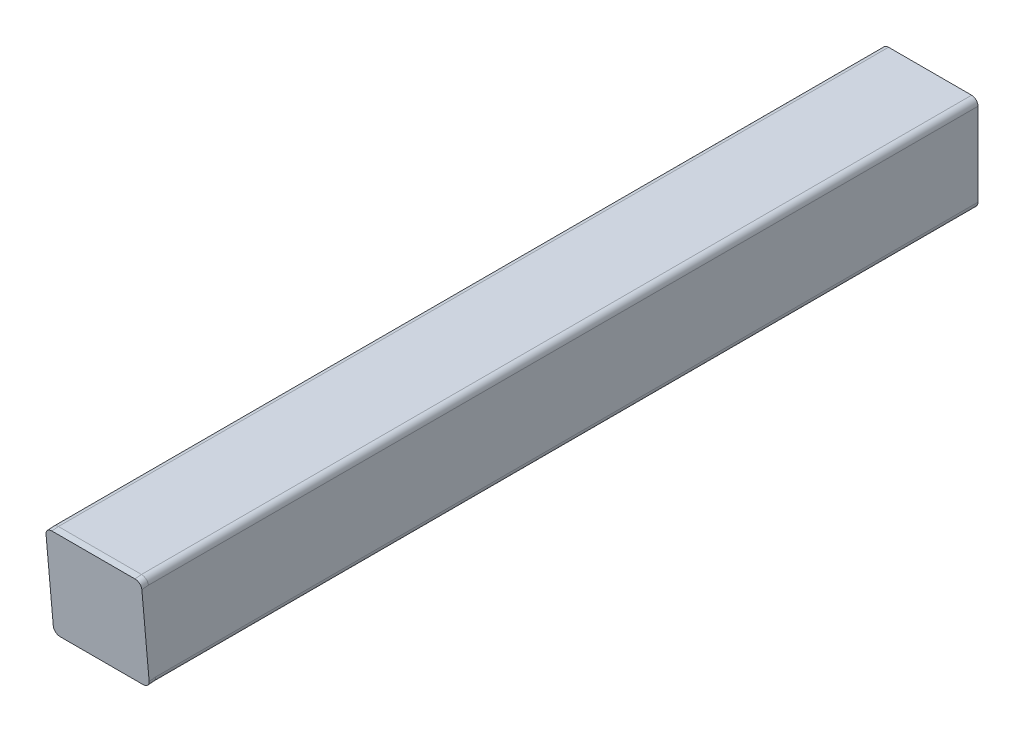
ISO-10303-21;
HEADER;
FILE_DESCRIPTION(('STEP AP214'),'2;1');
FILE_NAME('part.step','',(''),(''),'','','');
FILE_SCHEMA(('AUTOMOTIVE_DESIGN { 1 0 10303 214 1 1 1 1 }'));
ENDSEC;
DATA;
#1=APPLICATION_CONTEXT('core data for automotive mechanical design processes');
#2=APPLICATION_PROTOCOL_DEFINITION('international standard','automotive_design',2000,#1);
#3=PRODUCT_CONTEXT('',#1,'mechanical');
#4=PRODUCT('Part','Part','',(#3));
#5=PRODUCT_RELATED_PRODUCT_CATEGORY('part','',(#4));
#6=PRODUCT_DEFINITION_FORMATION('','',#4);
#7=PRODUCT_DEFINITION_CONTEXT('part definition',#1,'design');
#8=PRODUCT_DEFINITION('design','',#6,#7);
#9=PRODUCT_DEFINITION_SHAPE('','',#8);
#10=(LENGTH_UNIT() NAMED_UNIT(*) SI_UNIT(.MILLI.,.METRE.));
#11=(NAMED_UNIT(*) PLANE_ANGLE_UNIT() SI_UNIT($,.RADIAN.));
#12=(NAMED_UNIT(*) SI_UNIT($,.STERADIAN.) SOLID_ANGLE_UNIT());
#13=UNCERTAINTY_MEASURE_WITH_UNIT(LENGTH_MEASURE(1.E-05),#10,'distance_accuracy_value','');
#14=(GEOMETRIC_REPRESENTATION_CONTEXT(3) GLOBAL_UNCERTAINTY_ASSIGNED_CONTEXT((#13)) GLOBAL_UNIT_ASSIGNED_CONTEXT((#10,
#11,#12)) REPRESENTATION_CONTEXT('',''));
#15=CARTESIAN_POINT('',(0.,0.,0.));
#16=DIRECTION('',(0.,0.,1.));
#17=DIRECTION('',(1.,0.,0.));
#18=AXIS2_PLACEMENT_3D('',#15,#16,#17);
#19=CARTESIAN_POINT('',(2.54,-35.56,0.));
#20=DIRECTION('',(0.,0.,1.));
#21=DIRECTION('',(1.,0.,0.));
#22=AXIS2_PLACEMENT_3D('',#19,#20,#21);
#23=PLANE('',#22);
#24=CARTESIAN_POINT('',(2.54,-35.56,0.));
#25=DIRECTION('',(0.,0.,1.));
#26=DIRECTION('',(1.,0.,0.));
#27=AXIS2_PLACEMENT_3D('',#24,#25,#26);
#28=CIRCLE('',#27,2.54);
#29=CARTESIAN_POINT('',(0.,-35.56,0.));
#30=VERTEX_POINT('',#29);
#31=CARTESIAN_POINT('',(2.54000000000002,-38.1,0.));
#32=VERTEX_POINT('',#31);
#33=EDGE_CURVE('E358',#30,#32,#28,.T.);
#34=ORIENTED_EDGE('',*,*,#33,.F.);
#35=DIRECTION('',(0.,-1.,0.));
#36=VECTOR('',#35,1.);
#37=CARTESIAN_POINT('',(0.,-2.54000000000002,0.));
#38=LINE('',#37,#36);
#39=CARTESIAN_POINT('',(0.,-2.54000000000002,0.));
#40=VERTEX_POINT('',#39);
#41=EDGE_CURVE('E342',#40,#30,#38,.T.);
#42=ORIENTED_EDGE('',*,*,#41,.F.);
#43=CARTESIAN_POINT('',(2.54,-2.54,0.));
#44=DIRECTION('',(0.,0.,1.));
#45=DIRECTION('',(-1.,0.,0.));
#46=AXIS2_PLACEMENT_3D('',#43,#44,#45);
#47=CIRCLE('',#46,2.54);
#48=CARTESIAN_POINT('',(2.54000000000002,0.,0.));
#49=VERTEX_POINT('',#48);
#50=EDGE_CURVE('E345',#49,#40,#47,.T.);
#51=ORIENTED_EDGE('',*,*,#50,.F.);
#52=DIRECTION('',(-1.,0.,0.));
#53=VECTOR('',#52,1.);
#54=CARTESIAN_POINT('',(2.54000000000002,0.,0.));
#55=LINE('',#54,#53);
#56=CARTESIAN_POINT('',(35.56,0.,0.));
#57=VERTEX_POINT('',#56);
#58=EDGE_CURVE('E348',#57,#49,#55,.T.);
#59=ORIENTED_EDGE('',*,*,#58,.F.);
#60=CARTESIAN_POINT('',(35.56,-2.54,0.));
#61=DIRECTION('',(0.,0.,1.));
#62=DIRECTION('',(1.,0.,0.));
#63=AXIS2_PLACEMENT_3D('',#60,#61,#62);
#64=CIRCLE('',#63,2.54);
#65=CARTESIAN_POINT('',(38.1,-2.54000000000002,0.));
#66=VERTEX_POINT('',#65);
#67=EDGE_CURVE('E350',#66,#57,#64,.T.);
#68=ORIENTED_EDGE('',*,*,#67,.F.);
#69=DIRECTION('',(0.,1.,0.));
#70=VECTOR('',#69,1.);
#71=CARTESIAN_POINT('',(38.1,-2.54000000000002,0.));
#72=LINE('',#71,#70);
#73=CARTESIAN_POINT('',(38.1,-35.56,0.));
#74=VERTEX_POINT('',#73);
#75=EDGE_CURVE('E352',#74,#66,#72,.T.);
#76=ORIENTED_EDGE('',*,*,#75,.F.);
#77=CARTESIAN_POINT('',(35.56,-35.56,0.));
#78=DIRECTION('',(0.,0.,1.));
#79=DIRECTION('',(-1.,0.,0.));
#80=AXIS2_PLACEMENT_3D('',#77,#78,#79);
#81=CIRCLE('',#80,2.54);
#82=CARTESIAN_POINT('',(35.56,-38.1,0.));
#83=VERTEX_POINT('',#82);
#84=EDGE_CURVE('E355',#83,#74,#81,.T.);
#85=ORIENTED_EDGE('',*,*,#84,.F.);
#86=DIRECTION('',(1.,0.,0.));
#87=VECTOR('',#86,1.);
#88=CARTESIAN_POINT('',(2.54000000000002,-38.1,0.));
#89=LINE('',#88,#87);
#90=EDGE_CURVE('E321',#32,#83,#89,.T.);
#91=ORIENTED_EDGE('',*,*,#90,.F.);
#92=EDGE_LOOP('',(#34,#42,#51,#59,#68,#76,#85,#91));
#93=FACE_BOUND('',#92,.T.);
#94=CARTESIAN_POINT('',(5.3086,-32.7914,0.));
#95=DIRECTION('',(0.,0.,1.));
#96=DIRECTION('',(1.,0.,0.));
#97=AXIS2_PLACEMENT_3D('',#94,#95,#96);
#98=CIRCLE('',#97,2.54);
#99=CARTESIAN_POINT('',(2.7686,-32.7914,0.));
#100=VERTEX_POINT('',#99);
#101=CARTESIAN_POINT('',(5.30860000000002,-35.3314,0.));
#102=VERTEX_POINT('',#101);
#103=EDGE_CURVE('E400',#100,#102,#98,.T.);
#104=ORIENTED_EDGE('',*,*,#103,.T.);
#105=DIRECTION('',(1.,0.,0.));
#106=VECTOR('',#105,1.);
#107=CARTESIAN_POINT('',(5.30860000000002,-35.3314,0.));
#108=LINE('',#107,#106);
#109=CARTESIAN_POINT('',(32.7914,-35.3314,0.));
#110=VERTEX_POINT('',#109);
#111=EDGE_CURVE('E397',#102,#110,#108,.T.);
#112=ORIENTED_EDGE('',*,*,#111,.T.);
#113=CARTESIAN_POINT('',(32.7914,-32.7914,0.));
#114=DIRECTION('',(0.,0.,1.));
#115=DIRECTION('',(1.,0.,0.));
#116=AXIS2_PLACEMENT_3D('',#113,#114,#115);
#117=CIRCLE('',#116,2.54);
#118=CARTESIAN_POINT('',(35.3314,-32.7914,0.));
#119=VERTEX_POINT('',#118);
#120=EDGE_CURVE('E394',#110,#119,#117,.T.);
#121=ORIENTED_EDGE('',*,*,#120,.T.);
#122=DIRECTION('',(0.,1.,0.));
#123=VECTOR('',#122,1.);
#124=CARTESIAN_POINT('',(35.3314,-5.30860000000002,0.));
#125=LINE('',#124,#123);
#126=CARTESIAN_POINT('',(35.3314,-5.30860000000002,0.));
#127=VERTEX_POINT('',#126);
#128=EDGE_CURVE('E391',#119,#127,#125,.T.);
#129=ORIENTED_EDGE('',*,*,#128,.T.);
#130=CARTESIAN_POINT('',(32.7914,-5.3086,0.));
#131=DIRECTION('',(0.,0.,1.));
#132=DIRECTION('',(1.,0.,0.));
#133=AXIS2_PLACEMENT_3D('',#130,#131,#132);
#134=CIRCLE('',#133,2.54);
#135=CARTESIAN_POINT('',(32.7914,-2.7686,0.));
#136=VERTEX_POINT('',#135);
#137=EDGE_CURVE('E388',#127,#136,#134,.T.);
#138=ORIENTED_EDGE('',*,*,#137,.T.);
#139=DIRECTION('',(-1.,0.,0.));
#140=VECTOR('',#139,1.);
#141=CARTESIAN_POINT('',(5.30860000000002,-2.7686,0.));
#142=LINE('',#141,#140);
#143=CARTESIAN_POINT('',(5.30860000000002,-2.7686,0.));
#144=VERTEX_POINT('',#143);
#145=EDGE_CURVE('E385',#136,#144,#142,.T.);
#146=ORIENTED_EDGE('',*,*,#145,.T.);
#147=CARTESIAN_POINT('',(5.3086,-5.3086,0.));
#148=DIRECTION('',(0.,0.,1.));
#149=DIRECTION('',(1.,0.,0.));
#150=AXIS2_PLACEMENT_3D('',#147,#148,#149);
#151=CIRCLE('',#150,2.54);
#152=CARTESIAN_POINT('',(2.7686,-5.30860000000002,0.));
#153=VERTEX_POINT('',#152);
#154=EDGE_CURVE('E382',#144,#153,#151,.T.);
#155=ORIENTED_EDGE('',*,*,#154,.T.);
#156=DIRECTION('',(0.,-1.,0.));
#157=VECTOR('',#156,1.);
#158=CARTESIAN_POINT('',(2.7686,-5.30860000000002,0.));
#159=LINE('',#158,#157);
#160=EDGE_CURVE('E379',#153,#100,#159,.T.);
#161=ORIENTED_EDGE('',*,*,#160,.T.);
#162=EDGE_LOOP('',(#104,#112,#121,#129,#138,#146,#155,#161));
#163=FACE_BOUND('',#162,.T.);
#164=ADVANCED_FACE('F33',(#93,#163),#23,.F.);
#165=CARTESIAN_POINT('',(2.54,-35.56,330.));
#166=DIRECTION('',(0.,0.,-1.));
#167=DIRECTION('',(-1.,0.,0.));
#168=AXIS2_PLACEMENT_3D('',#165,#166,#167);
#169=CYLINDRICAL_SURFACE('',#168,2.54);
#170=DIRECTION('',(0.,0.,-1.));
#171=VECTOR('',#170,1.);
#172=CARTESIAN_POINT('',(2.54000000000002,-38.1,330.));
#173=LINE('',#172,#171);
#174=CARTESIAN_POINT('',(2.54000000000002,-38.1,326.666681919662));
#175=VERTEX_POINT('',#174);
#176=EDGE_CURVE('E41',#175,#32,#173,.T.);
#177=ORIENTED_EDGE('',*,*,#176,.F.);
#178=CARTESIAN_POINT('',(2.54,-35.56,326.888903125018));
#179=DIRECTION('',(0.,0.0871557427476583,-0.996194698091746));
#180=DIRECTION('',(0.,-0.996194698091746,-0.0871557427476583));
#181=AXIS2_PLACEMENT_3D('',#178,#179,#180);
#182=ELLIPSE('',#181,2.5497023873601,2.54);
#183=CARTESIAN_POINT('',(0.,-35.56,326.888903125018));
#184=VERTEX_POINT('',#183);
#185=EDGE_CURVE('E403',#175,#184,#182,.T.);
#186=ORIENTED_EDGE('',*,*,#185,.T.);
#187=DIRECTION('',(0.,0.,-1.));
#188=VECTOR('',#187,1.);
#189=CARTESIAN_POINT('',(0.,-35.56,330.));
#190=LINE('',#189,#188);
#191=EDGE_CURVE('E339',#184,#30,#190,.T.);
#192=ORIENTED_EDGE('',*,*,#191,.T.);
#193=ORIENTED_EDGE('',*,*,#33,.T.);
#194=EDGE_LOOP('',(#177,#186,#192,#193));
#195=FACE_BOUND('',#194,.T.);
#196=ADVANCED_FACE('F35',(#195),#169,.T.);
#197=CARTESIAN_POINT('',(2.54000000000002,-38.1,330.));
#198=DIRECTION('',(0.,1.,0.));
#199=DIRECTION('',(0.,0.,1.));
#200=AXIS2_PLACEMENT_3D('',#197,#198,#199);
#201=PLANE('',#200);
#202=DIRECTION('',(0.,0.,-1.));
#203=VECTOR('',#202,1.);
#204=CARTESIAN_POINT('',(35.56,-38.1,330.));
#205=LINE('',#204,#203);
#206=CARTESIAN_POINT('',(35.56,-38.1,326.666681919662));
#207=VERTEX_POINT('',#206);
#208=EDGE_CURVE('E318',#207,#83,#205,.T.);
#209=ORIENTED_EDGE('',*,*,#208,.F.);
#210=DIRECTION('',(1.,0.,0.));
#211=VECTOR('',#210,1.);
#212=CARTESIAN_POINT('',(0.,-38.1,326.666681919662));
#213=LINE('',#212,#211);
#214=EDGE_CURVE('E189',#175,#207,#213,.T.);
#215=ORIENTED_EDGE('',*,*,#214,.F.);
#216=ORIENTED_EDGE('',*,*,#176,.T.);
#217=ORIENTED_EDGE('',*,*,#90,.T.);
#218=EDGE_LOOP('',(#209,#215,#216,#217));
#219=FACE_BOUND('',#218,.T.);
#220=ADVANCED_FACE('F307',(#219),#201,.F.);
#221=CARTESIAN_POINT('',(35.56,-35.56,330.));
#222=DIRECTION('',(0.,0.,-1.));
#223=DIRECTION('',(-1.,0.,0.));
#224=AXIS2_PLACEMENT_3D('',#221,#222,#223);
#225=CYLINDRICAL_SURFACE('',#224,2.54);
#226=DIRECTION('',(0.,0.,-1.));
#227=VECTOR('',#226,1.);
#228=CARTESIAN_POINT('',(38.1,-35.56,330.));
#229=LINE('',#228,#227);
#230=CARTESIAN_POINT('',(38.1,-35.56,326.888903125018));
#231=VERTEX_POINT('',#230);
#232=EDGE_CURVE('E325',#231,#74,#229,.T.);
#233=ORIENTED_EDGE('',*,*,#232,.F.);
#234=CARTESIAN_POINT('',(35.56,-35.56,326.888903125018));
#235=DIRECTION('',(0.,0.0871557427476583,-0.996194698091746));
#236=DIRECTION('',(0.,-0.996194698091746,-0.0871557427476583));
#237=AXIS2_PLACEMENT_3D('',#234,#235,#236);
#238=ELLIPSE('',#237,2.5497023873601,2.54);
#239=EDGE_CURVE('E406',#231,#207,#238,.T.);
#240=ORIENTED_EDGE('',*,*,#239,.T.);
#241=ORIENTED_EDGE('',*,*,#208,.T.);
#242=ORIENTED_EDGE('',*,*,#84,.T.);
#243=EDGE_LOOP('',(#233,#240,#241,#242));
#244=FACE_BOUND('',#243,.T.);
#245=ADVANCED_FACE('F304',(#244),#225,.T.);
#246=CARTESIAN_POINT('',(38.1,-2.54000000000002,330.));
#247=DIRECTION('',(-1.,0.,0.));
#248=DIRECTION('',(0.,-1.,0.));
#249=AXIS2_PLACEMENT_3D('',#246,#247,#248);
#250=PLANE('',#249);
#251=DIRECTION('',(0.,0.,-1.));
#252=VECTOR('',#251,1.);
#253=CARTESIAN_POINT('',(38.1,-2.54000000000002,330.));
#254=LINE('',#253,#252);
#255=CARTESIAN_POINT('',(38.1,-2.54000000000001,329.777778794644));
#256=VERTEX_POINT('',#255);
#257=EDGE_CURVE('E327',#256,#66,#254,.T.);
#258=ORIENTED_EDGE('',*,*,#257,.F.);
#259=DIRECTION('',(0.,0.0871557427476583,-0.996194698091745));
#260=VECTOR('',#259,1.);
#261=CARTESIAN_POINT('',(38.1,-7.4730056636738,386.162291540254));
#262=LINE('',#261,#260);
#263=CARTESIAN_POINT('',(38.1,-2.76794261949674,332.38317485752));
#264=VERTEX_POINT('',#263);
#265=EDGE_CURVE('E214',#264,#256,#262,.T.);
#266=ORIENTED_EDGE('',*,*,#265,.F.);
#267=DIRECTION('',(0.,0.996194698091746,0.0871557427476584));
#268=VECTOR('',#267,1.);
#269=CARTESIAN_POINT('',(38.1,-35.7879426194967,329.494299187894));
#270=LINE('',#269,#268);
#271=CARTESIAN_POINT('',(38.1,-35.7879426194967,329.494299187894));
#272=VERTEX_POINT('',#271);
#273=EDGE_CURVE('E198',#272,#264,#270,.T.);
#274=ORIENTED_EDGE('',*,*,#273,.F.);
#275=DIRECTION('',(0.,0.0871557427476583,-0.996194698091745));
#276=VECTOR('',#275,1.);
#277=CARTESIAN_POINT('',(38.1,-40.4930056636738,383.273415870628));
#278=LINE('',#277,#276);
#279=EDGE_CURVE('E212',#272,#231,#278,.T.);
#280=ORIENTED_EDGE('',*,*,#279,.T.);
#281=ORIENTED_EDGE('',*,*,#232,.T.);
#282=ORIENTED_EDGE('',*,*,#75,.T.);
#283=EDGE_LOOP('',(#258,#266,#274,#280,#281,#282));
#284=FACE_BOUND('',#283,.T.);
#285=ADVANCED_FACE('F300',(#284),#250,.F.);
#286=CARTESIAN_POINT('',(35.56,-2.54,330.));
#287=DIRECTION('',(0.,0.,-1.));
#288=DIRECTION('',(-1.,0.,0.));
#289=AXIS2_PLACEMENT_3D('',#286,#287,#288);
#290=CYLINDRICAL_SURFACE('',#289,2.54);
#291=DIRECTION('',(0.,0.,-1.));
#292=VECTOR('',#291,1.);
#293=CARTESIAN_POINT('',(35.56,0.,330.));
#294=LINE('',#293,#292);
#295=CARTESIAN_POINT('',(35.56,0.,330.));
#296=VERTEX_POINT('',#295);
#297=EDGE_CURVE('E331',#296,#57,#294,.T.);
#298=ORIENTED_EDGE('',*,*,#297,.F.);
#299=CARTESIAN_POINT('',(35.56,-2.54,329.777778794644));
#300=DIRECTION('',(0.,0.0871557427476583,-0.996194698091746));
#301=DIRECTION('',(0.,-0.996194698091746,-0.0871557427476583));
#302=AXIS2_PLACEMENT_3D('',#299,#300,#301);
#303=ELLIPSE('',#302,2.5497023873601,2.54);
#304=EDGE_CURVE('E408',#296,#256,#303,.T.);
#305=ORIENTED_EDGE('',*,*,#304,.T.);
#306=ORIENTED_EDGE('',*,*,#257,.T.);
#307=ORIENTED_EDGE('',*,*,#67,.T.);
#308=EDGE_LOOP('',(#298,#305,#306,#307));
#309=FACE_BOUND('',#308,.T.);
#310=ADVANCED_FACE('F296',(#309),#290,.T.);
#311=CARTESIAN_POINT('',(2.54000000000002,0.,330.));
#312=DIRECTION('',(0.,-1.,0.));
#313=DIRECTION('',(0.,0.,-1.));
#314=AXIS2_PLACEMENT_3D('',#311,#312,#313);
#315=PLANE('',#314);
#316=ORIENTED_EDGE('',*,*,#58,.T.);
#317=DIRECTION('',(0.,0.,-1.));
#318=VECTOR('',#317,1.);
#319=CARTESIAN_POINT('',(2.54000000000002,0.,330.));
#320=LINE('',#319,#318);
#321=CARTESIAN_POINT('',(2.54,0.,330.));
#322=VERTEX_POINT('',#321);
#323=EDGE_CURVE('E334',#322,#49,#320,.T.);
#324=ORIENTED_EDGE('',*,*,#323,.F.);
#325=DIRECTION('',(-1.,0.,0.));
#326=VECTOR('',#325,1.);
#327=CARTESIAN_POINT('',(2.54000000000002,0.,330.));
#328=LINE('',#327,#326);
#329=EDGE_CURVE('E341',#296,#322,#328,.T.);
#330=ORIENTED_EDGE('',*,*,#329,.F.);
#331=ORIENTED_EDGE('',*,*,#297,.T.);
#332=EDGE_LOOP('',(#316,#324,#330,#331));
#333=FACE_BOUND('',#332,.T.);
#334=ADVANCED_FACE('F292',(#333),#315,.F.);
#335=CARTESIAN_POINT('',(2.54,-2.54,330.));
#336=DIRECTION('',(0.,0.,-1.));
#337=DIRECTION('',(-1.,0.,0.));
#338=AXIS2_PLACEMENT_3D('',#335,#336,#337);
#339=CYLINDRICAL_SURFACE('',#338,2.54);
#340=DIRECTION('',(0.,0.,-1.));
#341=VECTOR('',#340,1.);
#342=CARTESIAN_POINT('',(0.,-2.54000000000002,330.));
#343=LINE('',#342,#341);
#344=CARTESIAN_POINT('',(0.,-2.54000000000002,329.777778794644));
#345=VERTEX_POINT('',#344);
#346=EDGE_CURVE('E337',#345,#40,#343,.T.);
#347=ORIENTED_EDGE('',*,*,#346,.F.);
#348=CARTESIAN_POINT('',(2.54,-2.54,329.777778794644));
#349=DIRECTION('',(0.,0.0871557427476583,-0.996194698091746));
#350=DIRECTION('',(0.,-0.996194698091746,-0.0871557427476583));
#351=AXIS2_PLACEMENT_3D('',#348,#349,#350);
#352=ELLIPSE('',#351,2.5497023873601,2.54);
#353=EDGE_CURVE('E48',#345,#322,#352,.T.);
#354=ORIENTED_EDGE('',*,*,#353,.T.);
#355=ORIENTED_EDGE('',*,*,#323,.T.);
#356=ORIENTED_EDGE('',*,*,#50,.T.);
#357=EDGE_LOOP('',(#347,#354,#355,#356));
#358=FACE_BOUND('',#357,.T.);
#359=ADVANCED_FACE('F289',(#358),#339,.T.);
#360=CARTESIAN_POINT('',(0.,-2.54000000000002,330.));
#361=DIRECTION('',(1.,0.,0.));
#362=DIRECTION('',(0.,1.,0.));
#363=AXIS2_PLACEMENT_3D('',#360,#361,#362);
#364=PLANE('',#363);
#365=ORIENTED_EDGE('',*,*,#191,.F.);
#366=DIRECTION('',(0.,0.0871557427476583,-0.996194698091745));
#367=VECTOR('',#366,1.);
#368=CARTESIAN_POINT('',(0.,-40.4930056636738,383.273415870628));
#369=LINE('',#368,#367);
#370=CARTESIAN_POINT('',(0.,-35.7879426194967,329.494299187894));
#371=VERTEX_POINT('',#370);
#372=EDGE_CURVE('E179',#371,#184,#369,.T.);
#373=ORIENTED_EDGE('',*,*,#372,.F.);
#374=DIRECTION('',(0.,-0.996194698091746,-0.0871557427476584));
#375=VECTOR('',#374,1.);
#376=CARTESIAN_POINT('',(0.,-2.76794261949676,332.38317485752));
#377=LINE('',#376,#375);
#378=CARTESIAN_POINT('',(0.,-2.76794261949676,332.38317485752));
#379=VERTEX_POINT('',#378);
#380=EDGE_CURVE('E173',#379,#371,#377,.T.);
#381=ORIENTED_EDGE('',*,*,#380,.F.);
#382=DIRECTION('',(0.,0.0871557427476583,-0.996194698091745));
#383=VECTOR('',#382,1.);
#384=CARTESIAN_POINT('',(0.,-7.47300566367382,386.162291540254));
#385=LINE('',#384,#383);
#386=EDGE_CURVE('E165',#379,#345,#385,.T.);
#387=ORIENTED_EDGE('',*,*,#386,.T.);
#388=ORIENTED_EDGE('',*,*,#346,.T.);
#389=ORIENTED_EDGE('',*,*,#41,.T.);
#390=EDGE_LOOP('',(#365,#373,#381,#387,#388,#389));
#391=FACE_BOUND('',#390,.T.);
#392=ADVANCED_FACE('F178',(#391),#364,.F.);
#393=CARTESIAN_POINT('',(5.3086,-32.7914,330.));
#394=DIRECTION('',(0.,0.,-1.));
#395=DIRECTION('',(-1.,0.,0.));
#396=AXIS2_PLACEMENT_3D('',#393,#394,#395);
#397=CYLINDRICAL_SURFACE('',#396,2.54);
#398=CARTESIAN_POINT('',(5.3086,-32.7914,327.131124238856));
#399=DIRECTION('',(0.,0.0871557427476583,-0.996194698091746));
#400=DIRECTION('',(0.,-0.996194698091746,-0.0871557427476583));
#401=AXIS2_PLACEMENT_3D('',#398,#399,#400);
#402=ELLIPSE('',#401,2.5497023873601,2.54);
#403=CARTESIAN_POINT('',(5.30860000000002,-35.3314,326.9089030335));
#404=VERTEX_POINT('',#403);
#405=CARTESIAN_POINT('',(2.7686,-32.7914,327.131124238856));
#406=VERTEX_POINT('',#405);
#407=EDGE_CURVE('E412',#404,#406,#402,.T.);
#408=ORIENTED_EDGE('',*,*,#407,.F.);
#409=DIRECTION('',(0.,0.,-1.));
#410=VECTOR('',#409,1.);
#411=CARTESIAN_POINT('',(5.30860000000002,-35.3314,330.));
#412=LINE('',#411,#410);
#413=EDGE_CURVE('E361',#404,#102,#412,.T.);
#414=ORIENTED_EDGE('',*,*,#413,.T.);
#415=ORIENTED_EDGE('',*,*,#103,.F.);
#416=DIRECTION('',(0.,0.,-1.));
#417=VECTOR('',#416,1.);
#418=CARTESIAN_POINT('',(2.7686,-32.7914,330.));
#419=LINE('',#418,#417);
#420=EDGE_CURVE('E377',#406,#100,#419,.T.);
#421=ORIENTED_EDGE('',*,*,#420,.F.);
#422=EDGE_LOOP('',(#408,#414,#415,#421));
#423=FACE_BOUND('',#422,.T.);
#424=ADVANCED_FACE('F279',(#423),#397,.F.);
#425=CARTESIAN_POINT('',(5.30860000000002,-35.3314,330.));
#426=DIRECTION('',(0.,1.,0.));
#427=DIRECTION('',(0.,0.,1.));
#428=AXIS2_PLACEMENT_3D('',#425,#426,#427);
#429=PLANE('',#428);
#430=DIRECTION('',(-1.,0.,0.));
#431=VECTOR('',#430,1.);
#432=CARTESIAN_POINT('',(5.30860000000002,-35.3314,326.9089030335));
#433=LINE('',#432,#431);
#434=CARTESIAN_POINT('',(32.7914,-35.3314,326.9089030335));
#435=VERTEX_POINT('',#434);
#436=EDGE_CURVE('E415',#435,#404,#433,.T.);
#437=ORIENTED_EDGE('',*,*,#436,.F.);
#438=DIRECTION('',(0.,0.,-1.));
#439=VECTOR('',#438,1.);
#440=CARTESIAN_POINT('',(32.7914,-35.3314,330.));
#441=LINE('',#440,#439);
#442=EDGE_CURVE('E365',#435,#110,#441,.T.);
#443=ORIENTED_EDGE('',*,*,#442,.T.);
#444=ORIENTED_EDGE('',*,*,#111,.F.);
#445=ORIENTED_EDGE('',*,*,#413,.F.);
#446=EDGE_LOOP('',(#437,#443,#444,#445));
#447=FACE_BOUND('',#446,.T.);
#448=ADVANCED_FACE('F275',(#447),#429,.T.);
#449=CARTESIAN_POINT('',(32.7914,-32.7914,330.));
#450=DIRECTION('',(0.,0.,-1.));
#451=DIRECTION('',(-1.,0.,0.));
#452=AXIS2_PLACEMENT_3D('',#449,#450,#451);
#453=CYLINDRICAL_SURFACE('',#452,2.54);
#454=CARTESIAN_POINT('',(32.7914,-32.7914,327.131124238856));
#455=DIRECTION('',(0.,0.0871557427476583,-0.996194698091746));
#456=DIRECTION('',(0.,-0.996194698091746,-0.0871557427476583));
#457=AXIS2_PLACEMENT_3D('',#454,#455,#456);
#458=ELLIPSE('',#457,2.5497023873601,2.54);
#459=CARTESIAN_POINT('',(35.3314,-32.7914,327.131124238856));
#460=VERTEX_POINT('',#459);
#461=EDGE_CURVE('E418',#460,#435,#458,.T.);
#462=ORIENTED_EDGE('',*,*,#461,.F.);
#463=DIRECTION('',(0.,0.,-1.));
#464=VECTOR('',#463,1.);
#465=CARTESIAN_POINT('',(35.3314,-32.7914,330.));
#466=LINE('',#465,#464);
#467=EDGE_CURVE('E367',#460,#119,#466,.T.);
#468=ORIENTED_EDGE('',*,*,#467,.T.);
#469=ORIENTED_EDGE('',*,*,#120,.F.);
#470=ORIENTED_EDGE('',*,*,#442,.F.);
#471=EDGE_LOOP('',(#462,#468,#469,#470));
#472=FACE_BOUND('',#471,.T.);
#473=ADVANCED_FACE('F271',(#472),#453,.F.);
#474=CARTESIAN_POINT('',(35.3314,-5.30860000000002,330.));
#475=DIRECTION('',(-1.,0.,0.));
#476=DIRECTION('',(0.,0.,1.));
#477=AXIS2_PLACEMENT_3D('',#474,#475,#476);
#478=PLANE('',#477);
#479=DIRECTION('',(0.,-0.996194698091746,-0.0871557427476583));
#480=VECTOR('',#479,1.);
#481=CARTESIAN_POINT('',(35.3314,-5.26827521882032,329.539085642019));
#482=LINE('',#481,#480);
#483=CARTESIAN_POINT('',(35.3314,-5.30860000000002,329.535557680806));
#484=VERTEX_POINT('',#483);
#485=EDGE_CURVE('E421',#484,#460,#482,.T.);
#486=ORIENTED_EDGE('',*,*,#485,.F.);
#487=DIRECTION('',(0.,0.,-1.));
#488=VECTOR('',#487,1.);
#489=CARTESIAN_POINT('',(35.3314,-5.30860000000002,330.));
#490=LINE('',#489,#488);
#491=EDGE_CURVE('E369',#484,#127,#490,.T.);
#492=ORIENTED_EDGE('',*,*,#491,.T.);
#493=ORIENTED_EDGE('',*,*,#128,.F.);
#494=ORIENTED_EDGE('',*,*,#467,.F.);
#495=EDGE_LOOP('',(#486,#492,#493,#494));
#496=FACE_BOUND('',#495,.T.);
#497=ADVANCED_FACE('F267',(#496),#478,.T.);
#498=CARTESIAN_POINT('',(32.7914,-5.3086,330.));
#499=DIRECTION('',(0.,0.,-1.));
#500=DIRECTION('',(-1.,0.,0.));
#501=AXIS2_PLACEMENT_3D('',#498,#499,#500);
#502=CYLINDRICAL_SURFACE('',#501,2.54);
#503=CARTESIAN_POINT('',(32.7914,-5.3086,329.535557680806));
#504=DIRECTION('',(0.,0.0871557427476583,-0.996194698091746));
#505=DIRECTION('',(0.,-0.996194698091746,-0.0871557427476583));
#506=AXIS2_PLACEMENT_3D('',#503,#504,#505);
#507=ELLIPSE('',#506,2.5497023873601,2.54);
#508=CARTESIAN_POINT('',(32.7914,-2.7686,329.757778886162));
#509=VERTEX_POINT('',#508);
#510=EDGE_CURVE('E424',#509,#484,#507,.T.);
#511=ORIENTED_EDGE('',*,*,#510,.F.);
#512=DIRECTION('',(0.,0.,-1.));
#513=VECTOR('',#512,1.);
#514=CARTESIAN_POINT('',(32.7914,-2.7686,330.));
#515=LINE('',#514,#513);
#516=EDGE_CURVE('E371',#509,#136,#515,.T.);
#517=ORIENTED_EDGE('',*,*,#516,.T.);
#518=ORIENTED_EDGE('',*,*,#137,.F.);
#519=ORIENTED_EDGE('',*,*,#491,.F.);
#520=EDGE_LOOP('',(#511,#517,#518,#519));
#521=FACE_BOUND('',#520,.T.);
#522=ADVANCED_FACE('F263',(#521),#502,.F.);
#523=CARTESIAN_POINT('',(5.30860000000002,-2.7686,330.));
#524=DIRECTION('',(0.,-1.,0.));
#525=DIRECTION('',(0.,0.,-1.));
#526=AXIS2_PLACEMENT_3D('',#523,#524,#525);
#527=PLANE('',#526);
#528=DIRECTION('',(1.,0.,0.));
#529=VECTOR('',#528,1.);
#530=CARTESIAN_POINT('',(5.30860000000002,-2.7686,329.757778886162));
#531=LINE('',#530,#529);
#532=CARTESIAN_POINT('',(5.30860000000002,-2.7686,329.757778886162));
#533=VERTEX_POINT('',#532);
#534=EDGE_CURVE('E427',#533,#509,#531,.T.);
#535=ORIENTED_EDGE('',*,*,#534,.F.);
#536=DIRECTION('',(0.,0.,-1.));
#537=VECTOR('',#536,1.);
#538=CARTESIAN_POINT('',(5.30860000000002,-2.7686,330.));
#539=LINE('',#538,#537);
#540=EDGE_CURVE('E373',#533,#144,#539,.T.);
#541=ORIENTED_EDGE('',*,*,#540,.T.);
#542=ORIENTED_EDGE('',*,*,#145,.F.);
#543=ORIENTED_EDGE('',*,*,#516,.F.);
#544=EDGE_LOOP('',(#535,#541,#542,#543));
#545=FACE_BOUND('',#544,.T.);
#546=ADVANCED_FACE('F259',(#545),#527,.T.);
#547=CARTESIAN_POINT('',(5.3086,-5.3086,330.));
#548=DIRECTION('',(0.,0.,-1.));
#549=DIRECTION('',(-1.,0.,0.));
#550=AXIS2_PLACEMENT_3D('',#547,#548,#549);
#551=CYLINDRICAL_SURFACE('',#550,2.54);
#552=CARTESIAN_POINT('',(5.3086,-5.3086,329.535557680806));
#553=DIRECTION('',(0.,0.0871557427476583,-0.996194698091746));
#554=DIRECTION('',(0.,-0.996194698091746,-0.0871557427476583));
#555=AXIS2_PLACEMENT_3D('',#552,#553,#554);
#556=ELLIPSE('',#555,2.5497023873601,2.54);
#557=CARTESIAN_POINT('',(2.7686,-5.30860000000002,329.535557680806));
#558=VERTEX_POINT('',#557);
#559=EDGE_CURVE('E192',#558,#533,#556,.T.);
#560=ORIENTED_EDGE('',*,*,#559,.F.);
#561=DIRECTION('',(0.,0.,-1.));
#562=VECTOR('',#561,1.);
#563=CARTESIAN_POINT('',(2.7686,-5.30860000000002,330.));
#564=LINE('',#563,#562);
#565=EDGE_CURVE('E375',#558,#153,#564,.T.);
#566=ORIENTED_EDGE('',*,*,#565,.T.);
#567=ORIENTED_EDGE('',*,*,#154,.F.);
#568=ORIENTED_EDGE('',*,*,#540,.F.);
#569=EDGE_LOOP('',(#560,#566,#567,#568));
#570=FACE_BOUND('',#569,.T.);
#571=ADVANCED_FACE('F256',(#570),#551,.F.);
#572=CARTESIAN_POINT('',(2.7686,-5.30860000000002,330.));
#573=DIRECTION('',(1.,0.,0.));
#574=DIRECTION('',(0.,0.,-1.));
#575=AXIS2_PLACEMENT_3D('',#572,#573,#574);
#576=PLANE('',#575);
#577=DIRECTION('',(0.,0.996194698091746,0.0871557427476583));
#578=VECTOR('',#577,1.);
#579=CARTESIAN_POINT('',(2.7686,-5.26827521882032,329.539085642019));
#580=LINE('',#579,#578);
#581=EDGE_CURVE('E11',#406,#558,#580,.T.);
#582=ORIENTED_EDGE('',*,*,#581,.F.);
#583=ORIENTED_EDGE('',*,*,#420,.T.);
#584=ORIENTED_EDGE('',*,*,#160,.F.);
#585=ORIENTED_EDGE('',*,*,#565,.F.);
#586=EDGE_LOOP('',(#582,#583,#584,#585));
#587=FACE_BOUND('',#586,.T.);
#588=ADVANCED_FACE('F253',(#587),#576,.T.);
#589=CARTESIAN_POINT('',(2.54000000000002,-4235.75285666006,-37.9550179972877));
#590=DIRECTION('',(0.,-0.0871557427476584,0.996194698091746));
#591=DIRECTION('',(0.,-0.996194698091746,-0.0871557427476584));
#592=AXIS2_PLACEMENT_3D('',#589,#590,#591);
#593=PLANE('',#592);
#594=ORIENTED_EDGE('',*,*,#380,.T.);
#595=CARTESIAN_POINT('',(2.54,-35.7879426194967,329.494299187894));
#596=DIRECTION('',(0.,-0.0871557427476583,0.996194698091746));
#597=DIRECTION('',(0.,-0.996194698091746,-0.0871557427476583));
#598=AXIS2_PLACEMENT_3D('',#595,#596,#597);
#599=ELLIPSE('',#598,2.5497023873601,2.54);
#600=CARTESIAN_POINT('',(2.54000000000002,-38.3279426194968,329.272077982539));
#601=VERTEX_POINT('',#600);
#602=EDGE_CURVE('E183',#371,#601,#599,.T.);
#603=ORIENTED_EDGE('',*,*,#602,.T.);
#604=DIRECTION('',(1.,0.,0.));
#605=VECTOR('',#604,1.);
#606=CARTESIAN_POINT('',(2.54000000000001,-38.3279426194968,329.272077982539));
#607=LINE('',#606,#605);
#608=CARTESIAN_POINT('',(35.56,-38.3279426194968,329.272077982538));
#609=VERTEX_POINT('',#608);
#610=EDGE_CURVE('E204',#601,#609,#607,.T.);
#611=ORIENTED_EDGE('',*,*,#610,.T.);
#612=CARTESIAN_POINT('',(35.56,-35.7879426194967,329.494299187894));
#613=DIRECTION('',(0.,-0.0871557427476583,0.996194698091746));
#614=DIRECTION('',(0.,-0.996194698091746,-0.0871557427476583));
#615=AXIS2_PLACEMENT_3D('',#612,#613,#614);
#616=ELLIPSE('',#615,2.5497023873601,2.54);
#617=EDGE_CURVE('E201',#609,#272,#616,.T.);
#618=ORIENTED_EDGE('',*,*,#617,.T.);
#619=ORIENTED_EDGE('',*,*,#273,.T.);
#620=CARTESIAN_POINT('',(35.56,-2.76794261949674,332.38317485752));
#621=DIRECTION('',(0.,-0.0871557427476583,0.996194698091746));
#622=DIRECTION('',(0.,-0.996194698091746,-0.0871557427476583));
#623=AXIS2_PLACEMENT_3D('',#620,#621,#622);
#624=ELLIPSE('',#623,2.5497023873601,2.54);
#625=CARTESIAN_POINT('',(35.56,-0.227942619496743,332.605396062876));
#626=VERTEX_POINT('',#625);
#627=EDGE_CURVE('E194',#264,#626,#624,.T.);
#628=ORIENTED_EDGE('',*,*,#627,.T.);
#629=DIRECTION('',(-1.,0.,0.));
#630=VECTOR('',#629,1.);
#631=CARTESIAN_POINT('',(35.56,-0.227942619496744,332.605396062876));
#632=LINE('',#631,#630);
#633=CARTESIAN_POINT('',(2.54,-0.227942619496735,332.605396062876));
#634=VERTEX_POINT('',#633);
#635=EDGE_CURVE('E188',#626,#634,#632,.T.);
#636=ORIENTED_EDGE('',*,*,#635,.T.);
#637=CARTESIAN_POINT('',(2.54,-2.76794261949674,332.38317485752));
#638=DIRECTION('',(0.,-0.0871557427476583,0.996194698091746));
#639=DIRECTION('',(0.,-0.996194698091746,-0.0871557427476583));
#640=AXIS2_PLACEMENT_3D('',#637,#638,#639);
#641=ELLIPSE('',#640,2.5497023873601,2.54);
#642=EDGE_CURVE('E169',#634,#379,#641,.T.);
#643=ORIENTED_EDGE('',*,*,#642,.T.);
#644=EDGE_LOOP('',(#594,#603,#611,#618,#619,#628,#636,#643));
#645=FACE_BOUND('',#644,.T.);
#646=ADVANCED_FACE('F186',(#645),#593,.T.);
#647=CARTESIAN_POINT('',(2.54,-7.4730056636738,386.162291540254));
#648=DIRECTION('',(0.,-0.0871557427476583,0.996194698091746));
#649=DIRECTION('',(0.,-0.996194698091746,-0.0871557427476583));
#650=AXIS2_PLACEMENT_3D('',#647,#648,#649);
#651=ELLIPSE('',#650,2.5497023873601,2.54);
#652=DIRECTION('',(0.,0.0871557427476583,-0.996194698091745));
#653=VECTOR('',#652,1.);
#654=SURFACE_OF_LINEAR_EXTRUSION('',#651,#653);
#655=ORIENTED_EDGE('',*,*,#642,.F.);
#656=DIRECTION('',(0.,0.0871557427476583,-0.996194698091745));
#657=VECTOR('',#656,1.);
#658=CARTESIAN_POINT('',(2.54,-4.9330056636738,386.384512745609));
#659=LINE('',#658,#657);
#660=EDGE_CURVE('E174',#634,#322,#659,.T.);
#661=ORIENTED_EDGE('',*,*,#660,.T.);
#662=ORIENTED_EDGE('',*,*,#353,.F.);
#663=ORIENTED_EDGE('',*,*,#386,.F.);
#664=EDGE_LOOP('',(#655,#661,#662,#663));
#665=FACE_BOUND('',#664,.T.);
#666=ADVANCED_FACE('F167',(#665),#654,.F.);
#667=CARTESIAN_POINT('',(35.56,-4.9330056636738,386.384512745609));
#668=DIRECTION('',(0.,-0.996194698091745,-0.0871557427476583));
#669=DIRECTION('',(0.,0.0871557427476583,-0.996194698091746));
#670=AXIS2_PLACEMENT_3D('',#667,#668,#669);
#671=PLANE('',#670);
#672=ORIENTED_EDGE('',*,*,#635,.F.);
#673=DIRECTION('',(0.,0.0871557427476583,-0.996194698091745));
#674=VECTOR('',#673,1.);
#675=CARTESIAN_POINT('',(35.56,-4.9330056636738,386.384512745609));
#676=LINE('',#675,#674);
#677=EDGE_CURVE('E216',#626,#296,#676,.T.);
#678=ORIENTED_EDGE('',*,*,#677,.T.);
#679=ORIENTED_EDGE('',*,*,#329,.T.);
#680=ORIENTED_EDGE('',*,*,#660,.F.);
#681=EDGE_LOOP('',(#672,#678,#679,#680));
#682=FACE_BOUND('',#681,.T.);
#683=ADVANCED_FACE('F228',(#682),#671,.F.);
#684=CARTESIAN_POINT('',(35.56,-7.4730056636738,386.162291540254));
#685=DIRECTION('',(0.,-0.0871557427476583,0.996194698091746));
#686=DIRECTION('',(0.,-0.996194698091746,-0.0871557427476583));
#687=AXIS2_PLACEMENT_3D('',#684,#685,#686);
#688=ELLIPSE('',#687,2.5497023873601,2.54);
#689=DIRECTION('',(0.,0.0871557427476583,-0.996194698091745));
#690=VECTOR('',#689,1.);
#691=SURFACE_OF_LINEAR_EXTRUSION('',#688,#690);
#692=ORIENTED_EDGE('',*,*,#627,.F.);
#693=ORIENTED_EDGE('',*,*,#265,.T.);
#694=ORIENTED_EDGE('',*,*,#304,.F.);
#695=ORIENTED_EDGE('',*,*,#677,.F.);
#696=EDGE_LOOP('',(#692,#693,#694,#695));
#697=FACE_BOUND('',#696,.T.);
#698=ADVANCED_FACE('F232',(#697),#691,.F.);
#699=CARTESIAN_POINT('',(35.56,-40.4930056636738,383.273415870628));
#700=DIRECTION('',(0.,-0.0871557427476583,0.996194698091746));
#701=DIRECTION('',(0.,-0.996194698091746,-0.0871557427476583));
#702=AXIS2_PLACEMENT_3D('',#699,#700,#701);
#703=ELLIPSE('',#702,2.5497023873601,2.54);
#704=DIRECTION('',(0.,0.0871557427476583,-0.996194698091745));
#705=VECTOR('',#704,1.);
#706=SURFACE_OF_LINEAR_EXTRUSION('',#703,#705);
#707=ORIENTED_EDGE('',*,*,#617,.F.);
#708=DIRECTION('',(0.,0.0871557427476583,-0.996194698091745));
#709=VECTOR('',#708,1.);
#710=CARTESIAN_POINT('',(35.56,-43.0330056636738,383.051194665272));
#711=LINE('',#710,#709);
#712=EDGE_CURVE('E210',#609,#207,#711,.T.);
#713=ORIENTED_EDGE('',*,*,#712,.T.);
#714=ORIENTED_EDGE('',*,*,#239,.F.);
#715=ORIENTED_EDGE('',*,*,#279,.F.);
#716=EDGE_LOOP('',(#707,#713,#714,#715));
#717=FACE_BOUND('',#716,.T.);
#718=ADVANCED_FACE('F236',(#717),#706,.F.);
#719=CARTESIAN_POINT('',(2.54000000000002,-43.0330056636738,383.051194665272));
#720=DIRECTION('',(0.,0.996194698091745,0.0871557427476583));
#721=DIRECTION('',(0.,-0.0871557427476583,0.996194698091746));
#722=AXIS2_PLACEMENT_3D('',#719,#720,#721);
#723=PLANE('',#722);
#724=ORIENTED_EDGE('',*,*,#610,.F.);
#725=DIRECTION('',(0.,0.0871557427476583,-0.996194698091745));
#726=VECTOR('',#725,1.);
#727=CARTESIAN_POINT('',(2.54000000000002,-43.0330056636738,383.051194665272));
#728=LINE('',#727,#726);
#729=EDGE_CURVE('E208',#601,#175,#728,.T.);
#730=ORIENTED_EDGE('',*,*,#729,.T.);
#731=ORIENTED_EDGE('',*,*,#214,.T.);
#732=ORIENTED_EDGE('',*,*,#712,.F.);
#733=EDGE_LOOP('',(#724,#730,#731,#732));
#734=FACE_BOUND('',#733,.T.);
#735=ADVANCED_FACE('F240',(#734),#723,.F.);
#736=CARTESIAN_POINT('',(2.54000000000001,-40.4930056636738,383.273415870628));
#737=DIRECTION('',(0.,-0.0871557427476583,0.996194698091746));
#738=DIRECTION('',(0.,-0.996194698091746,-0.0871557427476583));
#739=AXIS2_PLACEMENT_3D('',#736,#737,#738);
#740=ELLIPSE('',#739,2.5497023873601,2.54);
#741=DIRECTION('',(0.,0.0871557427476583,-0.996194698091745));
#742=VECTOR('',#741,1.);
#743=SURFACE_OF_LINEAR_EXTRUSION('',#740,#742);
#744=ORIENTED_EDGE('',*,*,#602,.F.);
#745=ORIENTED_EDGE('',*,*,#372,.T.);
#746=ORIENTED_EDGE('',*,*,#185,.F.);
#747=ORIENTED_EDGE('',*,*,#729,.F.);
#748=EDGE_LOOP('',(#744,#745,#746,#747));
#749=FACE_BOUND('',#748,.T.);
#750=ADVANCED_FACE('F247',(#749),#743,.F.);
#751=CARTESIAN_POINT('',(2.54,-35.56,326.888903125018));
#752=DIRECTION('',(0.,-0.0871557427476583,0.996194698091746));
#753=DIRECTION('',(0.,-0.996194698091746,-0.0871557427476583));
#754=AXIS2_PLACEMENT_3D('',#751,#752,#753);
#755=PLANE('',#754);
#756=ORIENTED_EDGE('',*,*,#407,.T.);
#757=ORIENTED_EDGE('',*,*,#581,.T.);
#758=ORIENTED_EDGE('',*,*,#559,.T.);
#759=ORIENTED_EDGE('',*,*,#534,.T.);
#760=ORIENTED_EDGE('',*,*,#510,.T.);
#761=ORIENTED_EDGE('',*,*,#485,.T.);
#762=ORIENTED_EDGE('',*,*,#461,.T.);
#763=ORIENTED_EDGE('',*,*,#436,.T.);
#764=EDGE_LOOP('',(#756,#757,#758,#759,#760,#761,#762,#763));
#765=FACE_BOUND('',#764,.T.);
#766=ADVANCED_FACE('F229',(#765),#755,.F.);
#767=CLOSED_SHELL('',(#164,#196,#220,#245,#285,#310,#334,#359,#392,#424,#448,#473,#497,#522,
#546,#571,#588,#646,#666,#683,#698,#718,#735,#750,#766));
#768=MANIFOLD_SOLID_BREP('B2',#767);
#769=ADVANCED_BREP_SHAPE_REPRESENTATION('',(#18,#768),#14);
#770=SHAPE_DEFINITION_REPRESENTATION(#9,#769);
ENDSEC;
END-ISO-10303-21;
